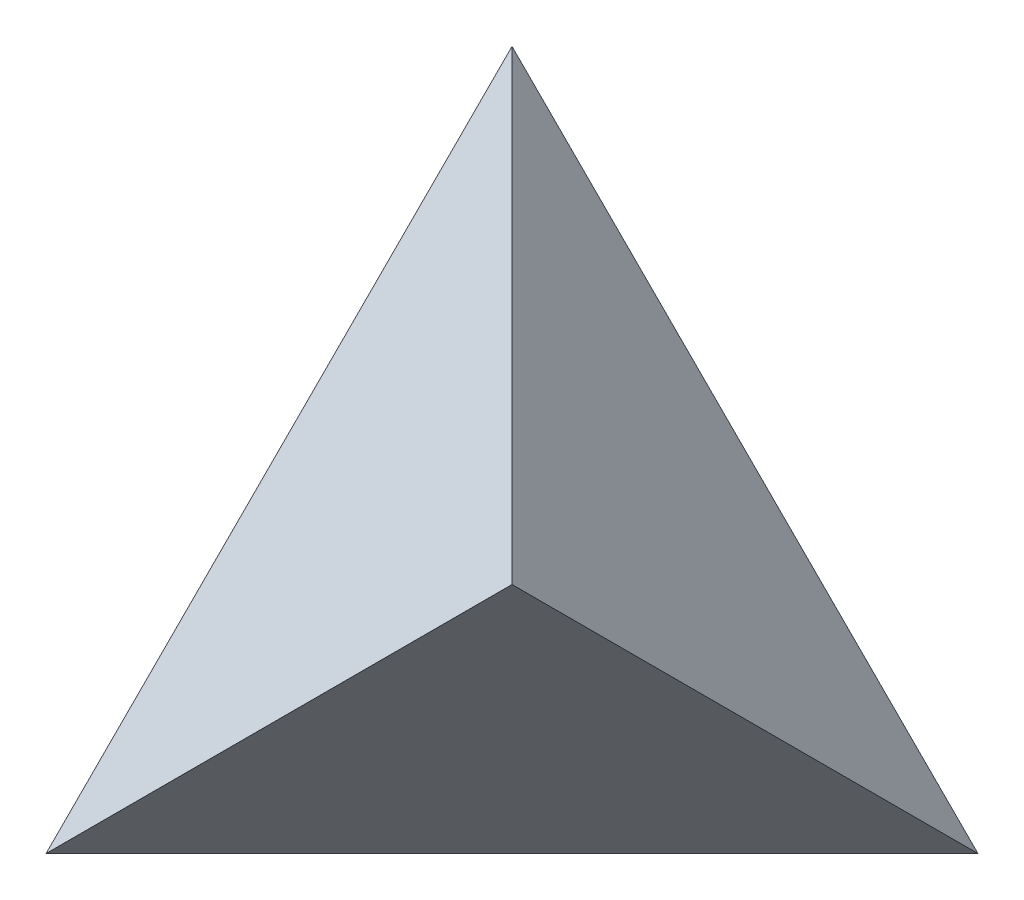
ISO-10303-21;
HEADER;
FILE_DESCRIPTION(('STEP AP214'),'2;1');
FILE_NAME('part.step','',(''),(''),'','','');
FILE_SCHEMA(('AUTOMOTIVE_DESIGN { 1 0 10303 214 1 1 1 1 }'));
ENDSEC;
DATA;
#1=APPLICATION_CONTEXT('core data for automotive mechanical design processes');
#2=APPLICATION_PROTOCOL_DEFINITION('international standard','automotive_design',2000,#1);
#3=PRODUCT_CONTEXT('',#1,'mechanical');
#4=PRODUCT('Part','Part','',(#3));
#5=PRODUCT_RELATED_PRODUCT_CATEGORY('part','',(#4));
#6=PRODUCT_DEFINITION_FORMATION('','',#4);
#7=PRODUCT_DEFINITION_CONTEXT('part definition',#1,'design');
#8=PRODUCT_DEFINITION('design','',#6,#7);
#9=PRODUCT_DEFINITION_SHAPE('','',#8);
#10=(LENGTH_UNIT() NAMED_UNIT(*) SI_UNIT(.MILLI.,.METRE.));
#11=(NAMED_UNIT(*) PLANE_ANGLE_UNIT() SI_UNIT($,.RADIAN.));
#12=(NAMED_UNIT(*) SI_UNIT($,.STERADIAN.) SOLID_ANGLE_UNIT());
#13=UNCERTAINTY_MEASURE_WITH_UNIT(LENGTH_MEASURE(1.E-05),#10,'distance_accuracy_value','');
#14=(GEOMETRIC_REPRESENTATION_CONTEXT(3) GLOBAL_UNCERTAINTY_ASSIGNED_CONTEXT((#13)) GLOBAL_UNIT_ASSIGNED_CONTEXT((#10,
#11,#12)) REPRESENTATION_CONTEXT('',''));
#15=CARTESIAN_POINT('',(0.,0.,0.));
#16=DIRECTION('',(0.,0.,1.));
#17=DIRECTION('',(1.,0.,0.));
#18=AXIS2_PLACEMENT_3D('',#15,#16,#17);
#19=CARTESIAN_POINT('',(7.07106781186547,-7.07106781186549,-7.07106781186548));
#20=DIRECTION('',(-0.577350269189626,-0.577350269189625,0.577350269189626));
#21=DIRECTION('',(0.707106781186548,0.,0.707106781186548));
#22=AXIS2_PLACEMENT_3D('',#19,#20,#21);
#23=PLANE('',#22);
#24=DIRECTION('',(-0.707106781186547,0.707106781186548,0.));
#25=VECTOR('',#24,1.);
#26=CARTESIAN_POINT('',(7.07106781186545,-7.07106781186548,-7.07106781186546));
#27=LINE('',#26,#25);
#28=CARTESIAN_POINT('',(7.07106781186547,-7.07106781186549,-7.07106781186547));
#29=VERTEX_POINT('',#28);
#30=CARTESIAN_POINT('',(-7.07106781186548,7.07106781186546,-7.07106781186547));
#31=VERTEX_POINT('',#30);
#32=EDGE_CURVE('E40',#29,#31,#27,.T.);
#33=ORIENTED_EDGE('',*,*,#32,.T.);
#34=DIRECTION('',(0.707106781186548,0.,0.707106781186547));
#35=VECTOR('',#34,1.);
#36=CARTESIAN_POINT('',(-7.07106781186549,7.07106781186545,-7.07106781186547));
#37=LINE('',#36,#35);
#38=CARTESIAN_POINT('',(7.07106781186548,7.07106781186546,7.07106781186547));
#39=VERTEX_POINT('',#38);
#40=EDGE_CURVE('E68',#31,#39,#37,.T.);
#41=ORIENTED_EDGE('',*,*,#40,.T.);
#42=DIRECTION('',(0.,-0.707106781186547,-0.707106781186547));
#43=VECTOR('',#42,1.);
#44=CARTESIAN_POINT('',(7.07106781186547,7.07106781186546,7.07106781186546));
#45=LINE('',#44,#43);
#46=EDGE_CURVE('E55',#39,#29,#45,.T.);
#47=ORIENTED_EDGE('',*,*,#46,.T.);
#48=EDGE_LOOP('',(#33,#41,#47));
#49=FACE_BOUND('',#48,.T.);
#50=ADVANCED_FACE('F37',(#49),#23,.F.);
#51=CARTESIAN_POINT('',(-7.07106781186547,-7.07106781186547,7.07106781186547));
#52=DIRECTION('',(0.577350269189627,0.577350269189625,0.577350269189626));
#53=DIRECTION('',(0.707106781186547,0.,-0.707106781186548));
#54=AXIS2_PLACEMENT_3D('',#51,#52,#53);
#55=PLANE('',#54);
#56=DIRECTION('',(0.,0.707106781186547,-0.707106781186548));
#57=VECTOR('',#56,1.);
#58=CARTESIAN_POINT('',(-7.07106781186547,-7.0710678118655,7.07106781186548));
#59=LINE('',#58,#57);
#60=CARTESIAN_POINT('',(-7.07106781186547,-7.07106781186548,7.07106781186547));
#61=VERTEX_POINT('',#60);
#62=EDGE_CURVE('E70',#61,#31,#59,.T.);
#63=ORIENTED_EDGE('',*,*,#62,.T.);
#64=ORIENTED_EDGE('',*,*,#32,.F.);
#65=DIRECTION('',(-0.707106781186547,0.,0.707106781186548));
#66=VECTOR('',#65,1.);
#67=CARTESIAN_POINT('',(7.07106781186547,-7.07106781186547,-7.07106781186547));
#68=LINE('',#67,#66);
#69=EDGE_CURVE('E47',#29,#61,#68,.T.);
#70=ORIENTED_EDGE('',*,*,#69,.T.);
#71=EDGE_LOOP('',(#63,#64,#70));
#72=FACE_BOUND('',#71,.T.);
#73=ADVANCED_FACE('F74',(#72),#55,.F.);
#74=CARTESIAN_POINT('',(-7.07106781186547,-7.07106781186549,7.07106781186548));
#75=DIRECTION('',(0.577350269189626,-0.577350269189625,-0.577350269189626));
#76=DIRECTION('',(-0.707106781186548,0.,-0.707106781186548));
#77=AXIS2_PLACEMENT_3D('',#74,#75,#76);
#78=PLANE('',#77);
#79=DIRECTION('',(0.707106781186547,0.707106781186548,0.));
#80=VECTOR('',#79,1.);
#81=CARTESIAN_POINT('',(-7.07106781186545,-7.07106781186548,7.07106781186546));
#82=LINE('',#81,#80);
#83=EDGE_CURVE('E11',#61,#39,#82,.T.);
#84=ORIENTED_EDGE('',*,*,#83,.T.);
#85=ORIENTED_EDGE('',*,*,#40,.F.);
#86=ORIENTED_EDGE('',*,*,#62,.F.);
#87=EDGE_LOOP('',(#84,#85,#86));
#88=FACE_BOUND('',#87,.T.);
#89=ADVANCED_FACE('F72',(#88),#78,.F.);
#90=CARTESIAN_POINT('',(7.07106781186547,-7.07106781186547,-7.07106781186547));
#91=DIRECTION('',(-0.577350269189627,0.577350269189625,-0.577350269189626));
#92=DIRECTION('',(-0.707106781186547,0.,0.707106781186548));
#93=AXIS2_PLACEMENT_3D('',#90,#91,#92);
#94=PLANE('',#93);
#95=ORIENTED_EDGE('',*,*,#46,.F.);
#96=ORIENTED_EDGE('',*,*,#83,.F.);
#97=ORIENTED_EDGE('',*,*,#69,.F.);
#98=EDGE_LOOP('',(#95,#96,#97));
#99=FACE_BOUND('',#98,.T.);
#100=ADVANCED_FACE('F111',(#99),#94,.F.);
#101=CLOSED_SHELL('',(#50,#73,#89,#100));
#102=MANIFOLD_SOLID_BREP('B2',#101);
#103=ADVANCED_BREP_SHAPE_REPRESENTATION('',(#18,#102),#14);
#104=SHAPE_DEFINITION_REPRESENTATION(#9,#103);
ENDSEC;
END-ISO-10303-21;
